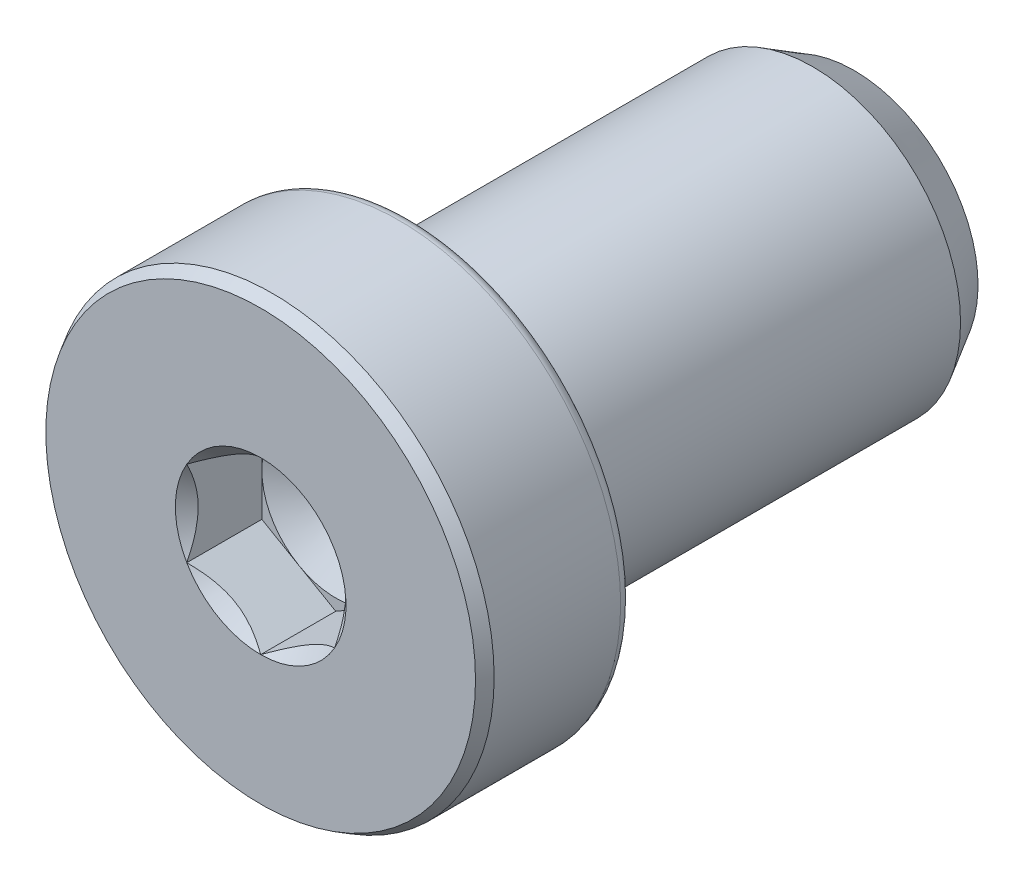
ISO-10303-21;
HEADER;
FILE_DESCRIPTION(('STEP AP214'),'2;1');
FILE_NAME('part.step','',(''),(''),'','','');
FILE_SCHEMA(('AUTOMOTIVE_DESIGN { 1 0 10303 214 1 1 1 1 }'));
ENDSEC;
DATA;
#1=APPLICATION_CONTEXT('core data for automotive mechanical design processes');
#2=APPLICATION_PROTOCOL_DEFINITION('international standard','automotive_design',2000,#1);
#3=PRODUCT_CONTEXT('',#1,'mechanical');
#4=PRODUCT('Part','Part','',(#3));
#5=PRODUCT_RELATED_PRODUCT_CATEGORY('part','',(#4));
#6=PRODUCT_DEFINITION_FORMATION('','',#4);
#7=PRODUCT_DEFINITION_CONTEXT('part definition',#1,'design');
#8=PRODUCT_DEFINITION('design','',#6,#7);
#9=PRODUCT_DEFINITION_SHAPE('','',#8);
#10=(LENGTH_UNIT() NAMED_UNIT(*) SI_UNIT(.MILLI.,.METRE.));
#11=(NAMED_UNIT(*) PLANE_ANGLE_UNIT() SI_UNIT($,.RADIAN.));
#12=(NAMED_UNIT(*) SI_UNIT($,.STERADIAN.) SOLID_ANGLE_UNIT());
#13=UNCERTAINTY_MEASURE_WITH_UNIT(LENGTH_MEASURE(1.E-05),#10,'distance_accuracy_value','');
#14=(GEOMETRIC_REPRESENTATION_CONTEXT(3) GLOBAL_UNCERTAINTY_ASSIGNED_CONTEXT((#13)) GLOBAL_UNIT_ASSIGNED_CONTEXT((#10,
#11,#12)) REPRESENTATION_CONTEXT('',''));
#15=CARTESIAN_POINT('',(0.,0.,0.));
#16=DIRECTION('',(0.,0.,1.));
#17=DIRECTION('',(1.,0.,0.));
#18=AXIS2_PLACEMENT_3D('',#15,#16,#17);
#19=CARTESIAN_POINT('',(-3.175,0.,1.6129));
#20=DIRECTION('',(0.,0.,-1.));
#21=DIRECTION('',(-1.,0.,0.));
#22=AXIS2_PLACEMENT_3D('',#19,#20,#21);
#23=PLANE('',#22);
#24=CARTESIAN_POINT('',(0.,0.,1.6129));
#25=DIRECTION('',(0.,0.,1.));
#26=DIRECTION('',(1.,0.,0.));
#27=AXIS2_PLACEMENT_3D('',#24,#25,#26);
#28=CIRCLE('',#27,1.5875);
#29=CARTESIAN_POINT('',(1.5875,0.,1.6129));
#30=VERTEX_POINT('',#29);
#31=CARTESIAN_POINT('',(0.79375,1.3748153285078,1.6129));
#32=VERTEX_POINT('',#31);
#33=EDGE_CURVE('E88',#30,#32,#28,.T.);
#34=ORIENTED_EDGE('',*,*,#33,.F.);
#35=DIRECTION('',(0.,1.,0.));
#36=VECTOR('',#35,1.);
#37=CARTESIAN_POINT('',(1.5875,-0.916543552338531,1.6129));
#38=LINE('',#37,#36);
#39=CARTESIAN_POINT('',(1.5875,0.916543552338531,1.6129));
#40=VERTEX_POINT('',#39);
#41=EDGE_CURVE('E98',#30,#40,#38,.T.);
#42=ORIENTED_EDGE('',*,*,#41,.T.);
#43=DIRECTION('',(-0.866025403784439,0.5,0.));
#44=VECTOR('',#43,1.);
#45=CARTESIAN_POINT('',(1.5875,0.916543552338531,1.6129));
#46=LINE('',#45,#44);
#47=EDGE_CURVE('E101',#40,#32,#46,.T.);
#48=ORIENTED_EDGE('',*,*,#47,.T.);
#49=EDGE_LOOP('',(#34,#42,#48));
#50=FACE_BOUND('',#49,.T.);
#51=ADVANCED_FACE('F16',(#50),#23,.F.);
#52=CARTESIAN_POINT('',(-0.793750000000001,1.3748153285078,1.6129));
#53=VERTEX_POINT('',#52);
#54=EDGE_CURVE('E103',#32,#53,#28,.T.);
#55=ORIENTED_EDGE('',*,*,#54,.F.);
#56=CARTESIAN_POINT('',(0.,1.83308710467706,1.6129));
#57=VERTEX_POINT('',#56);
#58=EDGE_CURVE('E116',#32,#57,#46,.T.);
#59=ORIENTED_EDGE('',*,*,#58,.T.);
#60=DIRECTION('',(-0.866025403784438,-0.5,0.));
#61=VECTOR('',#60,1.);
#62=CARTESIAN_POINT('',(0.,1.83308710467706,1.6129));
#63=LINE('',#62,#61);
#64=EDGE_CURVE('E122',#57,#53,#63,.T.);
#65=ORIENTED_EDGE('',*,*,#64,.T.);
#66=EDGE_LOOP('',(#55,#59,#65));
#67=FACE_BOUND('',#66,.T.);
#68=ADVANCED_FACE('F174',(#67),#23,.F.);
#69=CARTESIAN_POINT('',(-1.5875,0.,1.6129));
#70=VERTEX_POINT('',#69);
#71=EDGE_CURVE('E526',#53,#70,#28,.T.);
#72=ORIENTED_EDGE('',*,*,#71,.F.);
#73=CARTESIAN_POINT('',(-1.5875,0.91654355233853,1.6129));
#74=VERTEX_POINT('',#73);
#75=EDGE_CURVE('E121',#53,#74,#63,.T.);
#76=ORIENTED_EDGE('',*,*,#75,.T.);
#77=DIRECTION('',(0.,-1.,0.));
#78=VECTOR('',#77,1.);
#79=CARTESIAN_POINT('',(-1.5875,0.91654355233853,1.6129));
#80=LINE('',#79,#78);
#81=EDGE_CURVE('E126',#74,#70,#80,.T.);
#82=ORIENTED_EDGE('',*,*,#81,.T.);
#83=EDGE_LOOP('',(#72,#76,#82));
#84=FACE_BOUND('',#83,.T.);
#85=ADVANCED_FACE('F179',(#84),#23,.F.);
#86=CARTESIAN_POINT('',(-0.79375,-1.3748153285078,1.6129));
#87=VERTEX_POINT('',#86);
#88=EDGE_CURVE('E204',#70,#87,#28,.T.);
#89=ORIENTED_EDGE('',*,*,#88,.F.);
#90=CARTESIAN_POINT('',(-1.5875,-0.916543552338531,1.6129));
#91=VERTEX_POINT('',#90);
#92=EDGE_CURVE('E125',#70,#91,#80,.T.);
#93=ORIENTED_EDGE('',*,*,#92,.T.);
#94=DIRECTION('',(0.866025403784439,-0.5,0.));
#95=VECTOR('',#94,1.);
#96=CARTESIAN_POINT('',(-1.5875,-0.916543552338531,1.6129));
#97=LINE('',#96,#95);
#98=EDGE_CURVE('E209',#91,#87,#97,.T.);
#99=ORIENTED_EDGE('',*,*,#98,.T.);
#100=EDGE_LOOP('',(#89,#93,#99));
#101=FACE_BOUND('',#100,.T.);
#102=ADVANCED_FACE('F193',(#101),#23,.F.);
#103=CARTESIAN_POINT('',(0.79375,-1.3748153285078,1.6129));
#104=VERTEX_POINT('',#103);
#105=EDGE_CURVE('E31',#87,#104,#28,.T.);
#106=ORIENTED_EDGE('',*,*,#105,.F.);
#107=CARTESIAN_POINT('',(0.,-1.83308710467706,1.6129));
#108=VERTEX_POINT('',#107);
#109=EDGE_CURVE('E201',#87,#108,#97,.T.);
#110=ORIENTED_EDGE('',*,*,#109,.T.);
#111=DIRECTION('',(0.866025403784438,0.5,0.));
#112=VECTOR('',#111,1.);
#113=CARTESIAN_POINT('',(0.,-1.83308710467706,1.6129));
#114=LINE('',#113,#112);
#115=EDGE_CURVE('E111',#108,#104,#114,.T.);
#116=ORIENTED_EDGE('',*,*,#115,.T.);
#117=EDGE_LOOP('',(#106,#110,#116));
#118=FACE_BOUND('',#117,.T.);
#119=ADVANCED_FACE('F185',(#118),#23,.F.);
#120=EDGE_CURVE('E85',#104,#30,#28,.T.);
#121=ORIENTED_EDGE('',*,*,#120,.F.);
#122=CARTESIAN_POINT('',(1.5875,-0.916543552338531,1.6129));
#123=VERTEX_POINT('',#122);
#124=EDGE_CURVE('E114',#104,#123,#114,.T.);
#125=ORIENTED_EDGE('',*,*,#124,.T.);
#126=EDGE_CURVE('E107',#123,#30,#38,.T.);
#127=ORIENTED_EDGE('',*,*,#126,.T.);
#128=EDGE_LOOP('',(#121,#125,#127));
#129=FACE_BOUND('',#128,.T.);
#130=ADVANCED_FACE('F113',(#129),#23,.F.);
#131=CARTESIAN_POINT('',(0.,0.,0.));
#132=DIRECTION('',(0.,0.,1.));
#133=DIRECTION('',(1.,0.,0.));
#134=AXIS2_PLACEMENT_3D('',#131,#132,#133);
#135=CYLINDRICAL_SURFACE('',#134,3.175);
#136=CARTESIAN_POINT('',(0.,0.,-8.636));
#137=DIRECTION('',(0.,0.,-1.));
#138=DIRECTION('',(0.,1.,0.));
#139=AXIS2_PLACEMENT_3D('',#136,#137,#138);
#140=CIRCLE('',#139,3.175);
#141=CARTESIAN_POINT('',(0.,3.175,-8.636));
#142=VERTEX_POINT('',#141);
#143=EDGE_CURVE('E147',#142,#142,#140,.T.);
#144=ORIENTED_EDGE('',*,*,#143,.F.);
#145=EDGE_LOOP('',(#144));
#146=FACE_BOUND('',#145,.T.);
#147=CARTESIAN_POINT('',(0.,0.,0.));
#148=DIRECTION('',(0.,0.,1.));
#149=DIRECTION('',(1.,0.,0.));
#150=AXIS2_PLACEMENT_3D('',#147,#148,#149);
#151=CIRCLE('',#150,3.175);
#152=CARTESIAN_POINT('',(3.175,0.,0.));
#153=VERTEX_POINT('',#152);
#154=EDGE_CURVE('E93',#153,#153,#151,.T.);
#155=ORIENTED_EDGE('',*,*,#154,.F.);
#156=EDGE_LOOP('',(#155));
#157=FACE_BOUND('',#156,.T.);
#158=ADVANCED_FACE('F184',(#146,#157),#135,.T.);
#159=CARTESIAN_POINT('',(0.,0.,-8.636));
#160=DIRECTION('',(0.,0.,1.));
#161=DIRECTION('',(0.,-1.,0.));
#162=AXIS2_PLACEMENT_3D('',#159,#160,#161);
#163=CONICAL_SURFACE('',#162,3.175,0.523598775598294);
#164=CARTESIAN_POINT('',(0.,0.,-9.525));
#165=DIRECTION('',(0.,0.,-1.));
#166=DIRECTION('',(0.,1.,0.));
#167=AXIS2_PLACEMENT_3D('',#164,#165,#166);
#168=CIRCLE('',#167,2.66173561069043);
#169=CARTESIAN_POINT('',(0.,2.66173561069043,-9.525));
#170=VERTEX_POINT('',#169);
#171=EDGE_CURVE('E133',#170,#170,#168,.T.);
#172=ORIENTED_EDGE('',*,*,#171,.F.);
#173=EDGE_LOOP('',(#172));
#174=FACE_BOUND('',#173,.T.);
#175=ORIENTED_EDGE('',*,*,#143,.T.);
#176=EDGE_LOOP('',(#175));
#177=FACE_BOUND('',#176,.T.);
#178=ADVANCED_FACE('F190',(#174,#177),#163,.T.);
#179=CARTESIAN_POINT('',(0.,0.,-9.525));
#180=DIRECTION('',(0.,0.,1.));
#181=DIRECTION('',(1.,0.,0.));
#182=AXIS2_PLACEMENT_3D('',#179,#180,#181);
#183=PLANE('',#182);
#184=ORIENTED_EDGE('',*,*,#171,.T.);
#185=EDGE_LOOP('',(#184));
#186=FACE_BOUND('',#185,.T.);
#187=ADVANCED_FACE('F354',(#186),#183,.F.);
#188=CARTESIAN_POINT('',(0.,0.,0.));
#189=DIRECTION('',(0.,0.,1.));
#190=DIRECTION('',(1.,0.,0.));
#191=AXIS2_PLACEMENT_3D('',#188,#189,#190);
#192=PLANE('',#191);
#193=CARTESIAN_POINT('',(0.,0.,0.));
#194=DIRECTION('',(0.,0.,1.));
#195=DIRECTION('',(1.,0.,0.));
#196=AXIS2_PLACEMENT_3D('',#193,#194,#195);
#197=CIRCLE('',#196,4.5085);
#198=CARTESIAN_POINT('',(4.5085,0.,0.));
#199=VERTEX_POINT('',#198);
#200=EDGE_CURVE('E155',#199,#199,#197,.F.);
#201=ORIENTED_EDGE('',*,*,#200,.T.);
#202=EDGE_LOOP('',(#201));
#203=FACE_BOUND('',#202,.T.);
#204=ORIENTED_EDGE('',*,*,#154,.T.);
#205=EDGE_LOOP('',(#204));
#206=FACE_BOUND('',#205,.T.);
#207=ADVANCED_FACE('F349',(#203,#206),#192,.F.);
#208=CARTESIAN_POINT('',(0.,0.,3.2258));
#209=DIRECTION('',(0.,0.,-1.));
#210=DIRECTION('',(-1.,0.,0.));
#211=AXIS2_PLACEMENT_3D('',#208,#209,#210);
#212=CYLINDRICAL_SURFACE('',#211,4.7625);
#213=CARTESIAN_POINT('',(0.,0.,2.9718));
#214=DIRECTION('',(0.,0.,1.));
#215=DIRECTION('',(1.,0.,0.));
#216=AXIS2_PLACEMENT_3D('',#213,#214,#215);
#217=CIRCLE('',#216,4.7625);
#218=CARTESIAN_POINT('',(4.7625,0.,2.9718));
#219=VERTEX_POINT('',#218);
#220=EDGE_CURVE('E11',#219,#219,#217,.F.);
#221=ORIENTED_EDGE('',*,*,#220,.T.);
#222=EDGE_LOOP('',(#221));
#223=FACE_BOUND('',#222,.T.);
#224=CARTESIAN_POINT('',(0.,0.,0.254));
#225=DIRECTION('',(0.,0.,1.));
#226=DIRECTION('',(1.,0.,0.));
#227=AXIS2_PLACEMENT_3D('',#224,#225,#226);
#228=CIRCLE('',#227,4.7625);
#229=CARTESIAN_POINT('',(4.7625,0.,0.254));
#230=VERTEX_POINT('',#229);
#231=EDGE_CURVE('E152',#230,#230,#228,.T.);
#232=ORIENTED_EDGE('',*,*,#231,.T.);
#233=EDGE_LOOP('',(#232));
#234=FACE_BOUND('',#233,.T.);
#235=ADVANCED_FACE('F345',(#223,#234),#212,.T.);
#236=CARTESIAN_POINT('',(0.,0.,3.2258));
#237=DIRECTION('',(0.,0.,1.));
#238=DIRECTION('',(1.,0.,0.));
#239=AXIS2_PLACEMENT_3D('',#236,#237,#238);
#240=PLANE('',#239);
#241=CARTESIAN_POINT('',(0.,0.,3.2258));
#242=DIRECTION('',(0.,0.,1.));
#243=DIRECTION('',(1.,0.,0.));
#244=AXIS2_PLACEMENT_3D('',#241,#242,#243);
#245=CIRCLE('',#244,4.61585303162584);
#246=CARTESIAN_POINT('',(4.61585303162584,0.,3.2258));
#247=VERTEX_POINT('',#246);
#248=EDGE_CURVE('E24',#247,#247,#245,.T.);
#249=ORIENTED_EDGE('',*,*,#248,.T.);
#250=EDGE_LOOP('',(#249));
#251=FACE_BOUND('',#250,.T.);
#252=CARTESIAN_POINT('',(0.,0.,3.2258));
#253=DIRECTION('',(0.,0.,1.));
#254=DIRECTION('',(1.,0.,0.));
#255=AXIS2_PLACEMENT_3D('',#252,#253,#254);
#256=CIRCLE('',#255,1.83308710467706);
#257=CARTESIAN_POINT('',(1.5875,0.916543552338533,3.2258));
#258=VERTEX_POINT('',#257);
#259=CARTESIAN_POINT('',(0.,1.83308710467706,3.2258));
#260=VERTEX_POINT('',#259);
#261=EDGE_CURVE('E302',#258,#260,#256,.T.);
#262=ORIENTED_EDGE('',*,*,#261,.F.);
#263=CARTESIAN_POINT('',(1.5875,-0.916543552338531,3.2258));
#264=VERTEX_POINT('',#263);
#265=EDGE_CURVE('E299',#264,#258,#256,.T.);
#266=ORIENTED_EDGE('',*,*,#265,.F.);
#267=CARTESIAN_POINT('',(0.,-1.83308710467706,3.2258));
#268=VERTEX_POINT('',#267);
#269=EDGE_CURVE('E296',#268,#264,#256,.T.);
#270=ORIENTED_EDGE('',*,*,#269,.F.);
#271=CARTESIAN_POINT('',(-1.5875,-0.916543552338531,3.2258));
#272=VERTEX_POINT('',#271);
#273=EDGE_CURVE('E298',#272,#268,#256,.T.);
#274=ORIENTED_EDGE('',*,*,#273,.F.);
#275=CARTESIAN_POINT('',(-1.5875,0.91654355233853,3.2258));
#276=VERTEX_POINT('',#275);
#277=EDGE_CURVE('E38',#276,#272,#256,.T.);
#278=ORIENTED_EDGE('',*,*,#277,.F.);
#279=EDGE_CURVE('E304',#260,#276,#256,.T.);
#280=ORIENTED_EDGE('',*,*,#279,.F.);
#281=EDGE_LOOP('',(#262,#266,#270,#274,#278,#280));
#282=FACE_BOUND('',#281,.T.);
#283=ADVANCED_FACE('F160',(#251,#282),#240,.T.);
#284=CARTESIAN_POINT('',(0.,0.,3.2258));
#285=DIRECTION('',(0.,0.,1.));
#286=DIRECTION('',(1.,0.,0.));
#287=AXIS2_PLACEMENT_3D('',#284,#285,#286);
#288=CONICAL_SURFACE('',#287,1.83308710467706,0.78539816339745);
#289=ORIENTED_EDGE('',*,*,#269,.T.);
#290=CARTESIAN_POINT('',(-0.000200000000000013,-1.8332025747309,3.22591548096371));
#291=CARTESIAN_POINT('',(0.0543752080991363,-1.80169356364378,3.1944308083706));
#292=CARTESIAN_POINT('',(0.10986303679029,-1.7696576508122,3.16479504601353));
#293=CARTESIAN_POINT('',(0.223009120846359,-1.70433272872468,3.11053226002083));
#294=CARTESIAN_POINT('',(0.280678141129381,-1.67103750434037,3.08593543513318));
#295=CARTESIAN_POINT('',(0.396965021873103,-1.60389924243976,3.04380036427258));
#296=CARTESIAN_POINT('',(0.455553255255931,-1.57007331012484,3.02615619272982));
#297=CARTESIAN_POINT('',(0.574019773254431,-1.50167663406845,2.99897147008497));
#298=CARTESIAN_POINT('',(0.633894437016105,-1.46710798082801,2.98941062069508));
#299=CARTESIAN_POINT('',(0.737081228123443,-1.40753305920537,2.98078441310401));
#300=CARTESIAN_POINT('',(0.780259984047713,-1.38260379284922,2.97950719280958));
#301=CARTESIAN_POINT('',(0.866546961464602,-1.33278598321002,2.9816570558147));
#302=CARTESIAN_POINT('',(0.909655152921388,-1.30789745726817,2.98508578854934));
#303=CARTESIAN_POINT('',(0.99545366499797,-1.25836166322468,2.99645099443334));
#304=CARTESIAN_POINT('',(1.03814359107459,-1.23371462291266,3.00439137180164));
#305=CARTESIAN_POINT('',(1.12280693652164,-1.18483421762831,3.0243484144511));
#306=CARTESIAN_POINT('',(1.16478004024493,-1.16060103489495,3.03636682920869));
#307=CARTESIAN_POINT('',(1.27228854188643,-1.09853097253205,3.07204689724725));
#308=CARTESIAN_POINT('',(1.3371572282911,-1.06107901897434,3.09839857230314));
#309=CARTESIAN_POINT('',(1.43253840061907,-1.00601067345516,3.1428835368517));
#310=CARTESIAN_POINT('',(1.46396930046384,-0.987864034968915,3.15851285780113));
#311=CARTESIAN_POINT('',(1.52625301443036,-0.951904515944214,3.1911984878611));
#312=CARTESIAN_POINT('',(1.55710609603942,-0.934091480971894,3.20825411565697));
#313=CARTESIAN_POINT('',(1.5877,-0.916428082284693,3.22591548096371));
#314=B_SPLINE_CURVE_WITH_KNOTS('',3,(#290,#291,#292,#293,#294,#295,#296,#297,#298,#299,#300,
#301,#302,#303,#304,#305,#306,#307,#308,#309,#310,#311,#312,#313),.UNSPECIFIED.,.F.,.F.,(4,2,2,
2,2,2,2,2,2,2,2,4),(0.,0.211482650810816,0.424197870807276,0.633533884524815,0.842342653263349,
0.991755553727142,1.14122083674205,1.29081565918877,1.44047473906438,1.6781878086972,
1.79671410024894,1.91518409436631),.UNSPECIFIED.);
#315=EDGE_CURVE('E243',#268,#264,#314,.T.);
#316=ORIENTED_EDGE('',*,*,#315,.F.);
#317=EDGE_LOOP('',(#289,#316));
#318=FACE_BOUND('',#317,.T.);
#319=ADVANCED_FACE('F238',(#318),#288,.F.);
#320=ORIENTED_EDGE('',*,*,#265,.T.);
#321=CARTESIAN_POINT('',(1.5875,-1.84970477554874,3.83024525545435));
#322=CARTESIAN_POINT('',(1.5875,-1.80476240161323,3.79614620724651));
#323=CARTESIAN_POINT('',(1.5875,-1.75957199127591,3.76237501996549));
#324=CARTESIAN_POINT('',(1.5875,-1.66859358890513,3.69562439142144));
#325=CARTESIAN_POINT('',(1.5875,-1.62280545190593,3.66264514794877));
#326=CARTESIAN_POINT('',(1.5875,-1.48372199909337,3.56462872521964));
#327=CARTESIAN_POINT('',(1.5875,-1.38939051281533,3.50103763657763));
#328=CARTESIAN_POINT('',(1.5875,-1.19143955808483,3.37599987518056));
#329=CARTESIAN_POINT('',(1.5875,-1.08759987527571,3.31489794243316));
#330=CARTESIAN_POINT('',(1.5875,-0.874706489424171,3.20298965374515));
#331=CARTESIAN_POINT('',(1.5875,-0.765671975931876,3.15214856323094));
#332=CARTESIAN_POINT('',(1.5875,-0.602217292023729,3.08994277390858));
#333=CARTESIAN_POINT('',(1.5875,-0.550263299229072,3.07212619520817));
#334=CARTESIAN_POINT('',(1.5875,-0.445082037752954,3.04066151407769));
#335=CARTESIAN_POINT('',(1.5875,-0.391854683443765,3.02701369283191));
#336=CARTESIAN_POINT('',(1.5875,-0.285344657119835,3.0048290273799));
#337=CARTESIAN_POINT('',(1.5875,-0.23208080025176,2.99620327456464));
#338=CARTESIAN_POINT('',(1.5875,-0.124959456461822,2.98423468252013));
#339=CARTESIAN_POINT('',(1.5875,-0.0711020785161885,2.98089088922502));
#340=CARTESIAN_POINT('',(1.5875,0.0346213127336416,2.97974382710976));
#341=CARTESIAN_POINT('',(1.5875,0.0864851538244495,2.98173466080529));
#342=CARTESIAN_POINT('',(1.5875,0.189778917884047,2.99068765274446));
#343=CARTESIAN_POINT('',(1.5875,0.24120879888127,2.99765028639644));
#344=CARTESIAN_POINT('',(1.5875,0.344133383821798,3.01628128536408));
#345=CARTESIAN_POINT('',(1.5875,0.395613227142087,3.0280304949707));
#346=CARTESIAN_POINT('',(1.5875,0.497445238738766,3.0556036611118));
#347=CARTESIAN_POINT('',(1.5875,0.547797493434235,3.07142730420948));
#348=CARTESIAN_POINT('',(1.5875,0.705347074802484,3.12691764105306));
#349=CARTESIAN_POINT('',(1.5875,0.810327219325186,3.1728631846517));
#350=CARTESIAN_POINT('',(1.5875,1.01536433709499,3.27504460754017));
#351=CARTESIAN_POINT('',(1.5875,1.1154020417157,3.33131726019905));
#352=CARTESIAN_POINT('',(1.5875,1.30660224220973,3.4474420087263));
#353=CARTESIAN_POINT('',(1.5875,1.39795887490448,3.50697843321191));
#354=CARTESIAN_POINT('',(1.5875,1.53255412397538,3.59902821426906));
#355=CARTESIAN_POINT('',(1.5875,1.57683885296757,3.63003850196453));
#356=CARTESIAN_POINT('',(1.5875,1.66480239792181,3.69288252233172));
#357=CARTESIAN_POINT('',(1.5875,1.70848137729566,3.72471602601618));
#358=CARTESIAN_POINT('',(1.5875,1.75190803946712,3.75689098268216));
#359=B_SPLINE_CURVE_WITH_KNOTS('',3,(#321,#322,#323,#324,#325,#326,#327,#328,#329,#330,#331,
#332,#333,#334,#335,#336,#337,#338,#339,#340,#341,#342,#343,#344,#345,#346,#347,#348,#349,#350,
#351,#352,#353,#354,#355,#356,#357,#358),.UNSPECIFIED.,.F.,.F.,(4,2,2,2,2,2,2,2,2,2,2,2,2,2,2,2,
2,2,4),(0.,0.16923836494495,0.338518567089996,0.679661123858775,1.04081978788656,
1.4007345722687,1.56536778611341,1.73001210208044,1.89164527471545,2.05324924865399,
2.20870658572817,2.3641787897747,2.52239358430593,2.68059621137079,3.02337227291479,
3.36739346776834,3.69436280654469,3.85654464650265,4.01868184887702),.UNSPECIFIED.);
#360=EDGE_CURVE('E252',#264,#258,#359,.T.);
#361=ORIENTED_EDGE('',*,*,#360,.F.);
#362=EDGE_LOOP('',(#320,#361));
#363=FACE_BOUND('',#362,.T.);
#364=ADVANCED_FACE('F335',(#363),#288,.F.);
#365=ORIENTED_EDGE('',*,*,#261,.T.);
#366=CARTESIAN_POINT('',(1.5877,0.916428082284693,3.22591548096371));
#367=CARTESIAN_POINT('',(1.53312479190086,0.947937093371809,3.1944308083706));
#368=CARTESIAN_POINT('',(1.47763696320971,0.979973006203395,3.16479504601353));
#369=CARTESIAN_POINT('',(1.36449087915364,1.04529792829092,3.11053226002082));
#370=CARTESIAN_POINT('',(1.30682185887062,1.07859315267522,3.08593543513318));
#371=CARTESIAN_POINT('',(1.1905349781269,1.14573141457583,3.04380036427258));
#372=CARTESIAN_POINT('',(1.13194674474407,1.17955734689075,3.02615619272982));
#373=CARTESIAN_POINT('',(1.01348022674557,1.24795402294714,2.99897147008497));
#374=CARTESIAN_POINT('',(0.953605562983895,1.28252267618758,2.98941062069508));
#375=CARTESIAN_POINT('',(0.850418771876557,1.34209759781022,2.98078441310401));
#376=CARTESIAN_POINT('',(0.807240015952287,1.36702686416637,2.97950719280958));
#377=CARTESIAN_POINT('',(0.720953038535398,1.41684467380557,2.9816570558147));
#378=CARTESIAN_POINT('',(0.677844847078612,1.44173319974742,2.98508578854934));
#379=CARTESIAN_POINT('',(0.59204633500203,1.49126899379091,2.99645099443334));
#380=CARTESIAN_POINT('',(0.549356408925406,1.51591603410293,3.00439137180164));
#381=CARTESIAN_POINT('',(0.464693063478359,1.56479643938728,3.0243484144511));
#382=CARTESIAN_POINT('',(0.422719959755075,1.58902962212064,3.03636682920869));
#383=CARTESIAN_POINT('',(0.315211458113566,1.65109968448354,3.07204689724724));
#384=CARTESIAN_POINT('',(0.2503427717089,1.68855163804125,3.09839857230314));
#385=CARTESIAN_POINT('',(0.154961599380924,1.74361998356043,3.1428835368517));
#386=CARTESIAN_POINT('',(0.123530699536156,1.76176662204668,3.15851285780113));
#387=CARTESIAN_POINT('',(0.0612469855696363,1.79772614107138,3.1911984878611));
#388=CARTESIAN_POINT('',(0.0303939039605756,1.8155391760437,3.20825411565697));
#389=CARTESIAN_POINT('',(-0.000200000000001375,1.8332025747309,3.22591548096371));
#390=B_SPLINE_CURVE_WITH_KNOTS('',3,(#366,#367,#368,#369,#370,#371,#372,#373,#374,#375,#376,
#377,#378,#379,#380,#381,#382,#383,#384,#385,#386,#387,#388,#389),.UNSPECIFIED.,.F.,.F.,(4,2,2,
2,2,2,2,2,2,2,2,4),(0.,0.211482650810816,0.424197870807275,0.633533884524815,0.842342653263347,
0.99175555372714,1.14122083674204,1.29081565918877,1.44047473906437,1.6781878086972,
1.79671410024894,1.91518409436631),.UNSPECIFIED.);
#391=EDGE_CURVE('E260',#258,#260,#390,.T.);
#392=ORIENTED_EDGE('',*,*,#391,.F.);
#393=EDGE_LOOP('',(#365,#392));
#394=FACE_BOUND('',#393,.T.);
#395=ADVANCED_FACE('F337',(#394),#288,.F.);
#396=ORIENTED_EDGE('',*,*,#279,.T.);
#397=CARTESIAN_POINT('',(0.000199999999998623,1.8332025747309,3.22591548096371));
#398=CARTESIAN_POINT('',(-0.0543752080991377,1.80169356364378,3.1944308083706));
#399=CARTESIAN_POINT('',(-0.109863036790291,1.7696576508122,3.16479504601353));
#400=CARTESIAN_POINT('',(-0.22300912084636,1.70433272872467,3.11053226002083));
#401=CARTESIAN_POINT('',(-0.280678141129382,1.67103750434037,3.08593543513318));
#402=CARTESIAN_POINT('',(-0.396965021873104,1.60389924243976,3.04380036427258));
#403=CARTESIAN_POINT('',(-0.455553255255932,1.57007331012484,3.02615619272982));
#404=CARTESIAN_POINT('',(-0.574019773254431,1.50167663406845,2.99897147008497));
#405=CARTESIAN_POINT('',(-0.633894437016105,1.46710798082801,2.98941062069508));
#406=CARTESIAN_POINT('',(-0.737081228123443,1.40753305920537,2.98078441310401));
#407=CARTESIAN_POINT('',(-0.780259984047712,1.38260379284922,2.97950719280958));
#408=CARTESIAN_POINT('',(-0.866546961464602,1.33278598321002,2.9816570558147));
#409=CARTESIAN_POINT('',(-0.909655152921388,1.30789745726817,2.98508578854934));
#410=CARTESIAN_POINT('',(-0.99545366499797,1.25836166322468,2.99645099443334));
#411=CARTESIAN_POINT('',(-1.03814359107459,1.23371462291266,3.00439137180164));
#412=CARTESIAN_POINT('',(-1.12280693652164,1.18483421762831,3.0243484144511));
#413=CARTESIAN_POINT('',(-1.16478004024493,1.16060103489495,3.03636682920869));
#414=CARTESIAN_POINT('',(-1.27228854188643,1.09853097253205,3.07204689724725));
#415=CARTESIAN_POINT('',(-1.3371572282911,1.06107901897434,3.09839857230314));
#416=CARTESIAN_POINT('',(-1.43253840061908,1.00601067345516,3.1428835368517));
#417=CARTESIAN_POINT('',(-1.46396930046384,0.987864034968914,3.15851285780113));
#418=CARTESIAN_POINT('',(-1.52625301443036,0.951904515944214,3.1911984878611));
#419=CARTESIAN_POINT('',(-1.55710609603942,0.934091480971893,3.20825411565697));
#420=CARTESIAN_POINT('',(-1.5877,0.916428082284693,3.22591548096371));
#421=B_SPLINE_CURVE_WITH_KNOTS('',3,(#397,#398,#399,#400,#401,#402,#403,#404,#405,#406,#407,
#408,#409,#410,#411,#412,#413,#414,#415,#416,#417,#418,#419,#420),.UNSPECIFIED.,.F.,.F.,(4,2,2,
2,2,2,2,2,2,2,2,4),(0.,0.211482650810816,0.424197870807275,0.633533884524815,0.842342653263347,
0.99175555372714,1.14122083674204,1.29081565918877,1.44047473906437,1.6781878086972,
1.79671410024894,1.91518409436631),.UNSPECIFIED.);
#422=EDGE_CURVE('E266',#260,#276,#421,.T.);
#423=ORIENTED_EDGE('',*,*,#422,.F.);
#424=EDGE_LOOP('',(#396,#423));
#425=FACE_BOUND('',#424,.T.);
#426=ADVANCED_FACE('F327',(#425),#288,.F.);
#427=ORIENTED_EDGE('',*,*,#277,.T.);
#428=CARTESIAN_POINT('',(-1.5875,-1.84970477544497,3.8302452553756));
#429=CARTESIAN_POINT('',(-1.5875,-1.80476240151239,3.7961462071708));
#430=CARTESIAN_POINT('',(-1.5875,-1.75957199117802,3.76237501989281));
#431=CARTESIAN_POINT('',(-1.5875,-1.66859358881314,3.69562439135481));
#432=CARTESIAN_POINT('',(-1.5875,-1.62280545181692,3.66264514788516));
#433=CARTESIAN_POINT('',(-1.5875,-1.48372199901346,3.56462872516513));
#434=CARTESIAN_POINT('',(-1.5875,-1.38939051274161,3.50103763652916));
#435=CARTESIAN_POINT('',(-1.5875,-1.1914395580246,3.37599987514454));
#436=CARTESIAN_POINT('',(-1.5875,-1.08759987522283,3.31489794240349));
#437=CARTESIAN_POINT('',(-1.5875,-0.874706489386589,3.20298965372726));
#438=CARTESIAN_POINT('',(-1.5875,-0.765671975902255,3.15214856321849));
#439=CARTESIAN_POINT('',(-1.5875,-0.602217292000085,3.08994277390013));
#440=CARTESIAN_POINT('',(-1.5875,-0.550263299202902,3.07212619519952));
#441=CARTESIAN_POINT('',(-1.5875,-0.445082037721645,3.04066151406916));
#442=CARTESIAN_POINT('',(-1.5875,-0.391854683409844,3.02701369282369));
#443=CARTESIAN_POINT('',(-1.5875,-0.285344657080773,3.0048290273729));
#444=CARTESIAN_POINT('',(-1.5875,-0.232080800210171,2.99620327455853));
#445=CARTESIAN_POINT('',(-1.5875,-0.124959456415258,2.98423468251639));
#446=CARTESIAN_POINT('',(-1.5875,-0.0711020784671778,2.98089088922275));
#447=CARTESIAN_POINT('',(-1.5875,0.0346213127870732,2.97974382711086));
#448=CARTESIAN_POINT('',(-1.5875,0.0864851538798613,2.98173466080825));
#449=CARTESIAN_POINT('',(-1.5875,0.189778917943215,2.99068765275143));
#450=CARTESIAN_POINT('',(-1.5875,0.241208798942215,2.99765028640556));
#451=CARTESIAN_POINT('',(-1.5875,0.34413338388625,3.0162812853777));
#452=CARTESIAN_POINT('',(-1.5875,0.395613227208263,3.02803049498668));
#453=CARTESIAN_POINT('',(-1.5875,0.497445238808221,3.05560366113255));
#454=CARTESIAN_POINT('',(-1.5875,0.547797493505245,3.07142730423263));
#455=CARTESIAN_POINT('',(-1.5875,0.705347074888854,3.12691764108752));
#456=CARTESIAN_POINT('',(-1.5875,0.810327219424593,3.17286318469654));
#457=CARTESIAN_POINT('',(-1.5875,1.01536433721947,3.27504460760694));
#458=CARTESIAN_POINT('',(-1.5875,1.11540204185221,3.33131726027736));
#459=CARTESIAN_POINT('',(-1.5875,1.30660224236785,3.44744200882669));
#460=CARTESIAN_POINT('',(-1.5875,1.39795887507228,3.50697843332275));
#461=CARTESIAN_POINT('',(-1.5875,1.53255412415747,3.59902821439552));
#462=CARTESIAN_POINT('',(-1.5875,1.57683885315435,3.63003850209615));
#463=CARTESIAN_POINT('',(-1.5875,1.66480239811795,3.69288252247367));
#464=CARTESIAN_POINT('',(-1.5875,1.70848137749646,3.72471602616328));
#465=CARTESIAN_POINT('',(-1.5875,1.75190803967258,3.75689098283441));
#466=B_SPLINE_CURVE_WITH_KNOTS('',3,(#428,#429,#430,#431,#432,#433,#434,#435,#436,#437,#438,
#439,#440,#441,#442,#443,#444,#445,#446,#447,#448,#449,#450,#451,#452,#453,#454,#455,#456,#457,
#458,#459,#460,#461,#462,#463,#464,#465),.UNSPECIFIED.,.F.,.F.,(4,2,2,2,2,2,2,2,2,2,2,2,2,2,2,2,
2,2,4),(0.,0.169238364932429,0.338518567064952,0.679661123808214,1.04081978780735,
1.40073457216113,1.56536778601317,1.73001210198752,1.89164527462954,2.0532492485751,
2.2087065856554,2.36417878970806,2.52239358424591,2.68059621131738,3.0233722729095,
3.36739346781148,3.69436280662923,3.85654464660762,4.01868184900242),.UNSPECIFIED.);
#467=EDGE_CURVE('E222',#276,#272,#466,.F.);
#468=ORIENTED_EDGE('',*,*,#467,.F.);
#469=EDGE_LOOP('',(#427,#468));
#470=FACE_BOUND('',#469,.T.);
#471=ADVANCED_FACE('F236',(#470),#288,.F.);
#472=ORIENTED_EDGE('',*,*,#273,.T.);
#473=CARTESIAN_POINT('',(-1.5877,-0.916428082284694,3.22591548096371));
#474=CARTESIAN_POINT('',(-1.53312479190086,-0.94793709337181,3.1944308083706));
#475=CARTESIAN_POINT('',(-1.47763696320971,-0.979973006203395,3.16479504601353));
#476=CARTESIAN_POINT('',(-1.36449087915364,-1.04529792829092,3.11053226002083));
#477=CARTESIAN_POINT('',(-1.30682185887062,-1.07859315267522,3.08593543513318));
#478=CARTESIAN_POINT('',(-1.1905349781269,-1.14573141457583,3.04380036427258));
#479=CARTESIAN_POINT('',(-1.13194674474407,-1.17955734689075,3.02615619272982));
#480=CARTESIAN_POINT('',(-1.01348022674557,-1.24795402294714,2.99897147008497));
#481=CARTESIAN_POINT('',(-0.953605562983896,-1.28252267618759,2.98941062069508));
#482=CARTESIAN_POINT('',(-0.850418771876558,-1.34209759781022,2.98078441310401));
#483=CARTESIAN_POINT('',(-0.807240015952288,-1.36702686416637,2.97950719280958));
#484=CARTESIAN_POINT('',(-0.720953038535399,-1.41684467380557,2.9816570558147));
#485=CARTESIAN_POINT('',(-0.677844847078612,-1.44173319974742,2.98508578854934));
#486=CARTESIAN_POINT('',(-0.592046335002031,-1.49126899379091,2.99645099443334));
#487=CARTESIAN_POINT('',(-0.549356408925406,-1.51591603410293,3.00439137180164));
#488=CARTESIAN_POINT('',(-0.464693063478359,-1.56479643938728,3.0243484144511));
#489=CARTESIAN_POINT('',(-0.422719959755075,-1.58902962212064,3.03636682920869));
#490=CARTESIAN_POINT('',(-0.315211458113567,-1.65109968448354,3.07204689724725));
#491=CARTESIAN_POINT('',(-0.2503427717089,-1.68855163804125,3.09839857230314));
#492=CARTESIAN_POINT('',(-0.154961599380925,-1.74361998356043,3.1428835368517));
#493=CARTESIAN_POINT('',(-0.123530699536157,-1.76176662204668,3.15851285780113));
#494=CARTESIAN_POINT('',(-0.0612469855696376,-1.79772614107138,3.1911984878611));
#495=CARTESIAN_POINT('',(-0.0303939039605771,-1.8155391760437,3.20825411565697));
#496=CARTESIAN_POINT('',(0.000199999999999761,-1.8332025747309,3.22591548096371));
#497=B_SPLINE_CURVE_WITH_KNOTS('',3,(#473,#474,#475,#476,#477,#478,#479,#480,#481,#482,#483,
#484,#485,#486,#487,#488,#489,#490,#491,#492,#493,#494,#495,#496),.UNSPECIFIED.,.F.,.F.,(4,2,2,
2,2,2,2,2,2,2,2,4),(0.,0.211482650810816,0.424197870807276,0.633533884524815,0.842342653263348,
0.991755553727141,1.14122083674204,1.29081565918877,1.44047473906438,1.6781878086972,
1.79671410024894,1.91518409436631),.UNSPECIFIED.);
#498=EDGE_CURVE('E211',#272,#268,#497,.T.);
#499=ORIENTED_EDGE('',*,*,#498,.F.);
#500=EDGE_LOOP('',(#472,#499));
#501=FACE_BOUND('',#500,.T.);
#502=ADVANCED_FACE('F231',(#501),#288,.F.);
#503=CARTESIAN_POINT('',(0.,-1.83308710467706,1.6129));
#504=DIRECTION('',(0.5,-0.866025403784438,0.));
#505=DIRECTION('',(0.866025403784439,0.5,0.));
#506=AXIS2_PLACEMENT_3D('',#503,#504,#505);
#507=PLANE('',#506);
#508=DIRECTION('',(0.,0.,1.));
#509=VECTOR('',#508,1.);
#510=CARTESIAN_POINT('',(0.,-1.83308710467706,1.6129));
#511=LINE('',#510,#509);
#512=EDGE_CURVE('E129',#108,#268,#511,.T.);
#513=ORIENTED_EDGE('',*,*,#512,.T.);
#514=ORIENTED_EDGE('',*,*,#315,.T.);
#515=DIRECTION('',(0.,0.,1.));
#516=VECTOR('',#515,1.);
#517=CARTESIAN_POINT('',(1.5875,-0.916543552338531,1.6129));
#518=LINE('',#517,#516);
#519=EDGE_CURVE('E141',#123,#264,#518,.T.);
#520=ORIENTED_EDGE('',*,*,#519,.F.);
#521=ORIENTED_EDGE('',*,*,#124,.F.);
#522=ORIENTED_EDGE('',*,*,#115,.F.);
#523=EDGE_LOOP('',(#513,#514,#520,#521,#522));
#524=FACE_BOUND('',#523,.T.);
#525=ADVANCED_FACE('F235',(#524),#507,.F.);
#526=CARTESIAN_POINT('',(1.5875,-0.916543552338531,1.6129));
#527=DIRECTION('',(1.,0.,0.));
#528=DIRECTION('',(0.,1.,0.));
#529=AXIS2_PLACEMENT_3D('',#526,#527,#528);
#530=PLANE('',#529);
#531=ORIENTED_EDGE('',*,*,#519,.T.);
#532=ORIENTED_EDGE('',*,*,#360,.T.);
#533=DIRECTION('',(0.,0.,1.));
#534=VECTOR('',#533,1.);
#535=CARTESIAN_POINT('',(1.5875,0.916543552338531,1.6129));
#536=LINE('',#535,#534);
#537=EDGE_CURVE('E110',#40,#258,#536,.T.);
#538=ORIENTED_EDGE('',*,*,#537,.F.);
#539=ORIENTED_EDGE('',*,*,#41,.F.);
#540=ORIENTED_EDGE('',*,*,#126,.F.);
#541=EDGE_LOOP('',(#531,#532,#538,#539,#540));
#542=FACE_BOUND('',#541,.T.);
#543=ADVANCED_FACE('F106',(#542),#530,.F.);
#544=CARTESIAN_POINT('',(1.5875,0.916543552338531,1.6129));
#545=DIRECTION('',(0.5,0.866025403784439,0.));
#546=DIRECTION('',(-0.866025403784439,0.5,0.));
#547=AXIS2_PLACEMENT_3D('',#544,#545,#546);
#548=PLANE('',#547);
#549=ORIENTED_EDGE('',*,*,#537,.T.);
#550=ORIENTED_EDGE('',*,*,#391,.T.);
#551=DIRECTION('',(0.,0.,1.));
#552=VECTOR('',#551,1.);
#553=CARTESIAN_POINT('',(0.,1.83308710467706,1.6129));
#554=LINE('',#553,#552);
#555=EDGE_CURVE('E137',#57,#260,#554,.T.);
#556=ORIENTED_EDGE('',*,*,#555,.F.);
#557=ORIENTED_EDGE('',*,*,#58,.F.);
#558=ORIENTED_EDGE('',*,*,#47,.F.);
#559=EDGE_LOOP('',(#549,#550,#556,#557,#558));
#560=FACE_BOUND('',#559,.T.);
#561=ADVANCED_FACE('F277',(#560),#548,.F.);
#562=CARTESIAN_POINT('',(0.,1.83308710467706,1.6129));
#563=DIRECTION('',(-0.5,0.866025403784438,0.));
#564=DIRECTION('',(-0.866025403784438,-0.5,0.));
#565=AXIS2_PLACEMENT_3D('',#562,#563,#564);
#566=PLANE('',#565);
#567=ORIENTED_EDGE('',*,*,#555,.T.);
#568=ORIENTED_EDGE('',*,*,#422,.T.);
#569=DIRECTION('',(0.,0.,1.));
#570=VECTOR('',#569,1.);
#571=CARTESIAN_POINT('',(-1.5875,0.91654355233853,1.6129));
#572=LINE('',#571,#570);
#573=EDGE_CURVE('E134',#74,#276,#572,.T.);
#574=ORIENTED_EDGE('',*,*,#573,.F.);
#575=ORIENTED_EDGE('',*,*,#75,.F.);
#576=ORIENTED_EDGE('',*,*,#64,.F.);
#577=EDGE_LOOP('',(#567,#568,#574,#575,#576));
#578=FACE_BOUND('',#577,.T.);
#579=ADVANCED_FACE('F273',(#578),#566,.F.);
#580=CARTESIAN_POINT('',(-1.5875,0.91654355233853,1.6129));
#581=DIRECTION('',(-1.,0.,0.));
#582=DIRECTION('',(0.,-1.,0.));
#583=AXIS2_PLACEMENT_3D('',#580,#581,#582);
#584=PLANE('',#583);
#585=ORIENTED_EDGE('',*,*,#573,.T.);
#586=ORIENTED_EDGE('',*,*,#467,.T.);
#587=DIRECTION('',(0.,0.,1.));
#588=VECTOR('',#587,1.);
#589=CARTESIAN_POINT('',(-1.5875,-0.916543552338531,1.6129));
#590=LINE('',#589,#588);
#591=EDGE_CURVE('E130',#91,#272,#590,.T.);
#592=ORIENTED_EDGE('',*,*,#591,.F.);
#593=ORIENTED_EDGE('',*,*,#92,.F.);
#594=ORIENTED_EDGE('',*,*,#81,.F.);
#595=EDGE_LOOP('',(#585,#586,#592,#593,#594));
#596=FACE_BOUND('',#595,.T.);
#597=ADVANCED_FACE('F276',(#596),#584,.F.);
#598=CARTESIAN_POINT('',(-1.5875,-0.916543552338531,1.6129));
#599=DIRECTION('',(-0.5,-0.866025403784439,0.));
#600=DIRECTION('',(0.866025403784439,-0.5,0.));
#601=AXIS2_PLACEMENT_3D('',#598,#599,#600);
#602=PLANE('',#601);
#603=ORIENTED_EDGE('',*,*,#591,.T.);
#604=ORIENTED_EDGE('',*,*,#498,.T.);
#605=ORIENTED_EDGE('',*,*,#512,.F.);
#606=ORIENTED_EDGE('',*,*,#109,.F.);
#607=ORIENTED_EDGE('',*,*,#98,.F.);
#608=EDGE_LOOP('',(#603,#604,#605,#606,#607));
#609=FACE_BOUND('',#608,.T.);
#610=ADVANCED_FACE('F208',(#609),#602,.F.);
#611=CARTESIAN_POINT('',(0.,0.,1.6129));
#612=DIRECTION('',(0.,0.,1.));
#613=DIRECTION('',(1.,0.,0.));
#614=AXIS2_PLACEMENT_3D('',#611,#612,#613);
#615=CONICAL_SURFACE('',#614,1.5875,1.0471975511966);
#616=CARTESIAN_POINT('',(0.,0.,1.07526666666667));
#617=DIRECTION('',(0.,0.,1.));
#618=DIRECTION('',(1.,0.,0.));
#619=AXIS2_PLACEMENT_3D('',#616,#617,#618);
#620=CIRCLE('',#619,0.656291750824048);
#621=CARTESIAN_POINT('',(0.656291750824048,0.,1.07526666666667));
#622=VERTEX_POINT('',#621);
#623=EDGE_CURVE('E102',#622,#622,#620,.T.);
#624=ORIENTED_EDGE('',*,*,#623,.F.);
#625=EDGE_LOOP('',(#624));
#626=FACE_BOUND('',#625,.T.);
#627=ORIENTED_EDGE('',*,*,#33,.T.);
#628=ORIENTED_EDGE('',*,*,#54,.T.);
#629=ORIENTED_EDGE('',*,*,#71,.T.);
#630=ORIENTED_EDGE('',*,*,#88,.T.);
#631=ORIENTED_EDGE('',*,*,#105,.T.);
#632=ORIENTED_EDGE('',*,*,#120,.T.);
#633=EDGE_LOOP('',(#627,#628,#629,#630,#631,#632));
#634=FACE_BOUND('',#633,.T.);
#635=ADVANCED_FACE('F87',(#626,#634),#615,.F.);
#636=CARTESIAN_POINT('',(0.,0.,1.07526666666667));
#637=DIRECTION('',(0.,0.,1.));
#638=DIRECTION('',(1.,0.,0.));
#639=AXIS2_PLACEMENT_3D('',#636,#637,#638);
#640=PLANE('',#639);
#641=ORIENTED_EDGE('',*,*,#623,.T.);
#642=EDGE_LOOP('',(#641));
#643=FACE_BOUND('',#642,.T.);
#644=ADVANCED_FACE('F170',(#643),#640,.T.);
#645=CARTESIAN_POINT('',(0.,0.,0.254));
#646=DIRECTION('',(0.,0.,1.));
#647=DIRECTION('',(1.,0.,0.));
#648=AXIS2_PLACEMENT_3D('',#645,#646,#647);
#649=TOROIDAL_SURFACE('',#648,4.5085,0.254);
#650=ORIENTED_EDGE('',*,*,#200,.F.);
#651=EDGE_LOOP('',(#650));
#652=FACE_BOUND('',#651,.T.);
#653=ORIENTED_EDGE('',*,*,#231,.F.);
#654=EDGE_LOOP('',(#653));
#655=FACE_BOUND('',#654,.T.);
#656=ADVANCED_FACE('F164',(#652,#655),#649,.T.);
#657=CARTESIAN_POINT('',(0.,0.,3.2258));
#658=DIRECTION('',(0.,0.,-1.));
#659=DIRECTION('',(-1.,0.,0.));
#660=AXIS2_PLACEMENT_3D('',#657,#658,#659);
#661=CONICAL_SURFACE('',#660,4.61585303162584,0.523598775598296);
#662=ORIENTED_EDGE('',*,*,#220,.F.);
#663=EDGE_LOOP('',(#662));
#664=FACE_BOUND('',#663,.T.);
#665=ORIENTED_EDGE('',*,*,#248,.F.);
#666=EDGE_LOOP('',(#665));
#667=FACE_BOUND('',#666,.T.);
#668=ADVANCED_FACE('F18',(#664,#667),#661,.T.);
#669=CLOSED_SHELL('',(#51,#68,#85,#102,#119,#130,#158,#178,#187,#207,#235,#283,#319,#364,#395,
#426,#471,#502,#525,#543,#561,#579,#597,#610,#635,#644,#656,#668));
#670=MANIFOLD_SOLID_BREP('B1',#669);
#671=ADVANCED_BREP_SHAPE_REPRESENTATION('',(#18,#670),#14);
#672=SHAPE_DEFINITION_REPRESENTATION(#9,#671);
ENDSEC;
END-ISO-10303-21;
